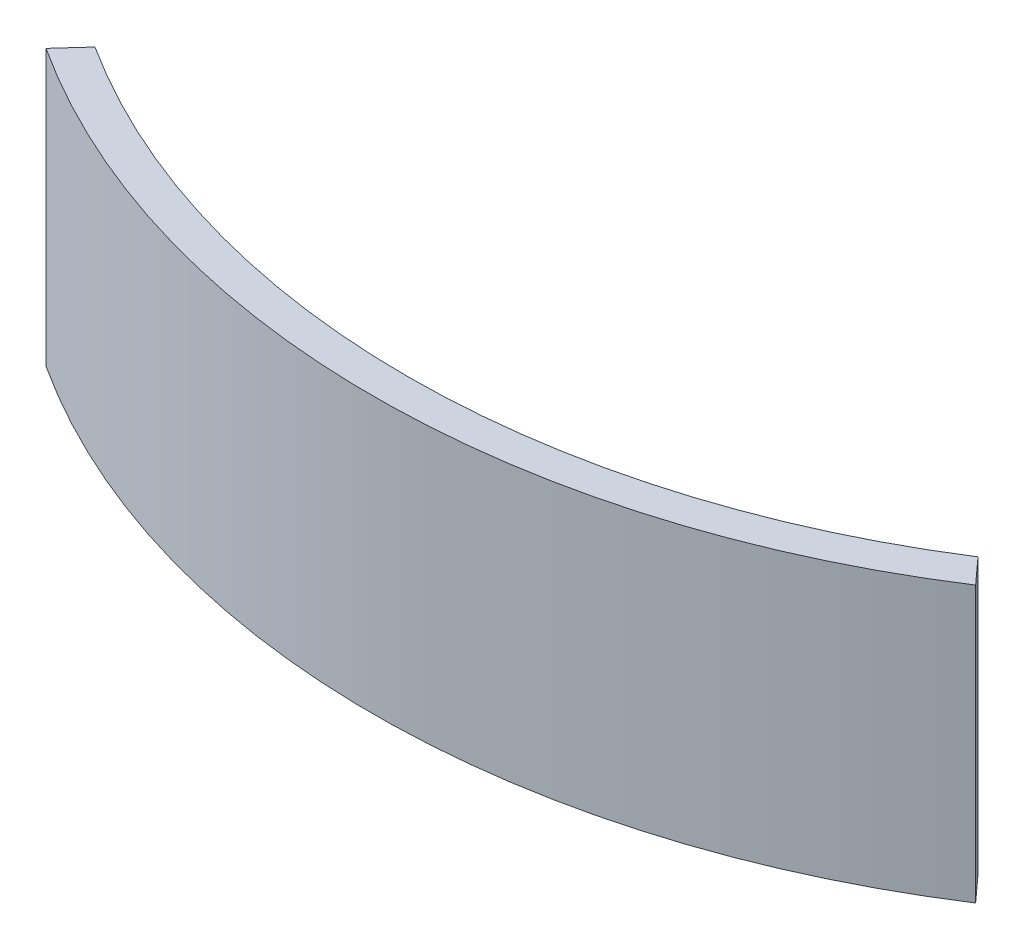
ISO-10303-21;
HEADER;
FILE_DESCRIPTION(('STEP AP214'),'2;1');
FILE_NAME('part.step','',(''),(''),'','','');
FILE_SCHEMA(('AUTOMOTIVE_DESIGN { 1 0 10303 214 1 1 1 1 }'));
ENDSEC;
DATA;
#1=APPLICATION_CONTEXT('core data for automotive mechanical design processes');
#2=APPLICATION_PROTOCOL_DEFINITION('international standard','automotive_design',2000,#1);
#3=PRODUCT_CONTEXT('',#1,'mechanical');
#4=PRODUCT('Part','Part','',(#3));
#5=PRODUCT_RELATED_PRODUCT_CATEGORY('part','',(#4));
#6=PRODUCT_DEFINITION_FORMATION('','',#4);
#7=PRODUCT_DEFINITION_CONTEXT('part definition',#1,'design');
#8=PRODUCT_DEFINITION('design','',#6,#7);
#9=PRODUCT_DEFINITION_SHAPE('','',#8);
#10=(LENGTH_UNIT() NAMED_UNIT(*) SI_UNIT(.MILLI.,.METRE.));
#11=(NAMED_UNIT(*) PLANE_ANGLE_UNIT() SI_UNIT($,.RADIAN.));
#12=(NAMED_UNIT(*) SI_UNIT($,.STERADIAN.) SOLID_ANGLE_UNIT());
#13=UNCERTAINTY_MEASURE_WITH_UNIT(LENGTH_MEASURE(1.E-05),#10,'distance_accuracy_value','');
#14=(GEOMETRIC_REPRESENTATION_CONTEXT(3) GLOBAL_UNCERTAINTY_ASSIGNED_CONTEXT((#13)) GLOBAL_UNIT_ASSIGNED_CONTEXT((#10,
#11,#12)) REPRESENTATION_CONTEXT('',''));
#15=CARTESIAN_POINT('',(0.,0.,0.));
#16=DIRECTION('',(0.,0.,1.));
#17=DIRECTION('',(1.,0.,0.));
#18=AXIS2_PLACEMENT_3D('',#15,#16,#17);
#19=CARTESIAN_POINT('',(0.,40.3,0.));
#20=DIRECTION('',(0.,-1.,0.));
#21=DIRECTION('',(0.,0.,-1.));
#22=AXIS2_PLACEMENT_3D('',#19,#20,#21);
#23=CYLINDRICAL_SURFACE('',#22,125.);
#24=CARTESIAN_POINT('',(0.,0.,0.));
#25=DIRECTION('',(0.,1.,0.));
#26=DIRECTION('',(0.,0.,1.));
#27=AXIS2_PLACEMENT_3D('',#24,#25,#26);
#28=CIRCLE('',#27,125.);
#29=CARTESIAN_POINT('',(-68.0341305140115,0.,104.863516464033));
#30=VERTEX_POINT('',#29);
#31=CARTESIAN_POINT('',(68.0341305140115,0.,104.863516464033));
#32=VERTEX_POINT('',#31);
#33=EDGE_CURVE('E107',#30,#32,#28,.T.);
#34=ORIENTED_EDGE('',*,*,#33,.T.);
#35=DIRECTION('',(0.,-1.,0.));
#36=VECTOR('',#35,1.);
#37=CARTESIAN_POINT('',(68.0341305140115,40.3,104.863516464033));
#38=LINE('',#37,#36);
#39=CARTESIAN_POINT('',(68.0341305140115,40.3,104.863516464033));
#40=VERTEX_POINT('',#39);
#41=EDGE_CURVE('E11',#40,#32,#38,.T.);
#42=ORIENTED_EDGE('',*,*,#41,.F.);
#43=CARTESIAN_POINT('',(0.,40.3,0.));
#44=DIRECTION('',(0.,1.,0.));
#45=DIRECTION('',(0.,0.,1.));
#46=AXIS2_PLACEMENT_3D('',#43,#44,#45);
#47=CIRCLE('',#46,125.);
#48=CARTESIAN_POINT('',(-68.0341305140115,40.3,104.863516464033));
#49=VERTEX_POINT('',#48);
#50=EDGE_CURVE('E91',#49,#40,#47,.T.);
#51=ORIENTED_EDGE('',*,*,#50,.F.);
#52=DIRECTION('',(0.,-1.,0.));
#53=VECTOR('',#52,1.);
#54=CARTESIAN_POINT('',(-68.0341305140115,40.3,104.863516464033));
#55=LINE('',#54,#53);
#56=EDGE_CURVE('E103',#49,#30,#55,.T.);
#57=ORIENTED_EDGE('',*,*,#56,.T.);
#58=EDGE_LOOP('',(#34,#42,#51,#57));
#59=FACE_BOUND('',#58,.T.);
#60=ADVANCED_FACE('F39',(#59),#23,.T.);
#61=CARTESIAN_POINT('',(68.0341305140115,40.3,104.863516464033));
#62=DIRECTION('',(-0.74086321214559,0.,0.671655939368751));
#63=DIRECTION('',(0.671655939368751,0.,0.74086321214559));
#64=AXIS2_PLACEMENT_3D('',#61,#62,#63);
#65=PLANE('',#64);
#66=DIRECTION('',(-0.67165593936875,0.,-0.74086321214559));
#67=VECTOR('',#66,1.);
#68=CARTESIAN_POINT('',(68.0341305140115,0.,104.863516464033));
#69=LINE('',#68,#67);
#70=CARTESIAN_POINT('',(64.6300256152893,0.,101.108653383215));
#71=VERTEX_POINT('',#70);
#72=EDGE_CURVE('E96',#32,#71,#69,.T.);
#73=ORIENTED_EDGE('',*,*,#72,.T.);
#74=DIRECTION('',(0.,-1.,0.));
#75=VECTOR('',#74,1.);
#76=CARTESIAN_POINT('',(64.6300256152893,40.3,101.108653383215));
#77=LINE('',#76,#75);
#78=CARTESIAN_POINT('',(64.6300256152893,40.3,101.108653383215));
#79=VERTEX_POINT('',#78);
#80=EDGE_CURVE('E48',#79,#71,#77,.T.);
#81=ORIENTED_EDGE('',*,*,#80,.F.);
#82=DIRECTION('',(-0.67165593936875,0.,-0.74086321214559));
#83=VECTOR('',#82,1.);
#84=CARTESIAN_POINT('',(68.0341305140115,40.3,104.863516464033));
#85=LINE('',#84,#83);
#86=EDGE_CURVE('E86',#40,#79,#85,.T.);
#87=ORIENTED_EDGE('',*,*,#86,.F.);
#88=ORIENTED_EDGE('',*,*,#41,.T.);
#89=EDGE_LOOP('',(#73,#81,#87,#88));
#90=FACE_BOUND('',#89,.T.);
#91=ADVANCED_FACE('F95',(#90),#65,.F.);
#92=CARTESIAN_POINT('',(0.,40.3,0.));
#93=DIRECTION('',(0.,-1.,0.));
#94=DIRECTION('',(0.,0.,-1.));
#95=AXIS2_PLACEMENT_3D('',#92,#93,#94);
#96=CYLINDRICAL_SURFACE('',#95,120.);
#97=CARTESIAN_POINT('',(0.,0.,0.));
#98=DIRECTION('',(0.,-1.,0.));
#99=DIRECTION('',(0.,0.,1.));
#100=AXIS2_PLACEMENT_3D('',#97,#98,#99);
#101=CIRCLE('',#100,120.);
#102=CARTESIAN_POINT('',(-64.6300256152893,0.,101.108653383215));
#103=VERTEX_POINT('',#102);
#104=EDGE_CURVE('E73',#71,#103,#101,.T.);
#105=ORIENTED_EDGE('',*,*,#104,.T.);
#106=DIRECTION('',(0.,-1.,0.));
#107=VECTOR('',#106,1.);
#108=CARTESIAN_POINT('',(-64.6300256152893,40.3,101.108653383215));
#109=LINE('',#108,#107);
#110=CARTESIAN_POINT('',(-64.6300256152893,40.3,101.108653383215));
#111=VERTEX_POINT('',#110);
#112=EDGE_CURVE('E98',#111,#103,#109,.T.);
#113=ORIENTED_EDGE('',*,*,#112,.F.);
#114=CARTESIAN_POINT('',(0.,40.3,0.));
#115=DIRECTION('',(0.,-1.,0.));
#116=DIRECTION('',(0.,0.,1.));
#117=AXIS2_PLACEMENT_3D('',#114,#115,#116);
#118=CIRCLE('',#117,120.);
#119=EDGE_CURVE('E89',#79,#111,#118,.T.);
#120=ORIENTED_EDGE('',*,*,#119,.F.);
#121=ORIENTED_EDGE('',*,*,#80,.T.);
#122=EDGE_LOOP('',(#105,#113,#120,#121));
#123=FACE_BOUND('',#122,.T.);
#124=ADVANCED_FACE('F99',(#123),#96,.F.);
#125=CARTESIAN_POINT('',(-68.0341305140115,40.3,104.863516464033));
#126=DIRECTION('',(0.740863212145586,0.,0.671655939368754));
#127=DIRECTION('',(0.671655939368754,0.,-0.740863212145586));
#128=AXIS2_PLACEMENT_3D('',#125,#126,#127);
#129=PLANE('',#128);
#130=DIRECTION('',(-0.671655939368754,0.,0.740863212145586));
#131=VECTOR('',#130,1.);
#132=CARTESIAN_POINT('',(-68.0341305140115,0.,104.863516464033));
#133=LINE('',#132,#131);
#134=EDGE_CURVE('E79',#103,#30,#133,.T.);
#135=ORIENTED_EDGE('',*,*,#134,.T.);
#136=ORIENTED_EDGE('',*,*,#56,.F.);
#137=DIRECTION('',(-0.671655939368754,0.,0.740863212145586));
#138=VECTOR('',#137,1.);
#139=CARTESIAN_POINT('',(-68.0341305140115,40.3,104.863516464033));
#140=LINE('',#139,#138);
#141=EDGE_CURVE('E56',#111,#49,#140,.T.);
#142=ORIENTED_EDGE('',*,*,#141,.F.);
#143=ORIENTED_EDGE('',*,*,#112,.T.);
#144=EDGE_LOOP('',(#135,#136,#142,#143));
#145=FACE_BOUND('',#144,.T.);
#146=ADVANCED_FACE('F120',(#145),#129,.F.);
#147=CARTESIAN_POINT('',(0.,40.3,0.));
#148=DIRECTION('',(0.,1.,0.));
#149=DIRECTION('',(0.,0.,1.));
#150=AXIS2_PLACEMENT_3D('',#147,#148,#149);
#151=PLANE('',#150);
#152=ORIENTED_EDGE('',*,*,#50,.T.);
#153=ORIENTED_EDGE('',*,*,#86,.T.);
#154=ORIENTED_EDGE('',*,*,#119,.T.);
#155=ORIENTED_EDGE('',*,*,#141,.T.);
#156=EDGE_LOOP('',(#152,#153,#154,#155));
#157=FACE_BOUND('',#156,.T.);
#158=ADVANCED_FACE('F87',(#157),#151,.T.);
#159=CARTESIAN_POINT('',(0.,0.,0.));
#160=DIRECTION('',(0.,1.,0.));
#161=DIRECTION('',(0.,0.,1.));
#162=AXIS2_PLACEMENT_3D('',#159,#160,#161);
#163=PLANE('',#162);
#164=ORIENTED_EDGE('',*,*,#33,.F.);
#165=ORIENTED_EDGE('',*,*,#134,.F.);
#166=ORIENTED_EDGE('',*,*,#104,.F.);
#167=ORIENTED_EDGE('',*,*,#72,.F.);
#168=EDGE_LOOP('',(#164,#165,#166,#167));
#169=FACE_BOUND('',#168,.T.);
#170=ADVANCED_FACE('F123',(#169),#163,.F.);
#171=CLOSED_SHELL('',(#60,#91,#124,#146,#158,#170));
#172=MANIFOLD_SOLID_BREP('B2',#171);
#173=ADVANCED_BREP_SHAPE_REPRESENTATION('',(#18,#172),#14);
#174=SHAPE_DEFINITION_REPRESENTATION(#9,#173);
ENDSEC;
END-ISO-10303-21;
